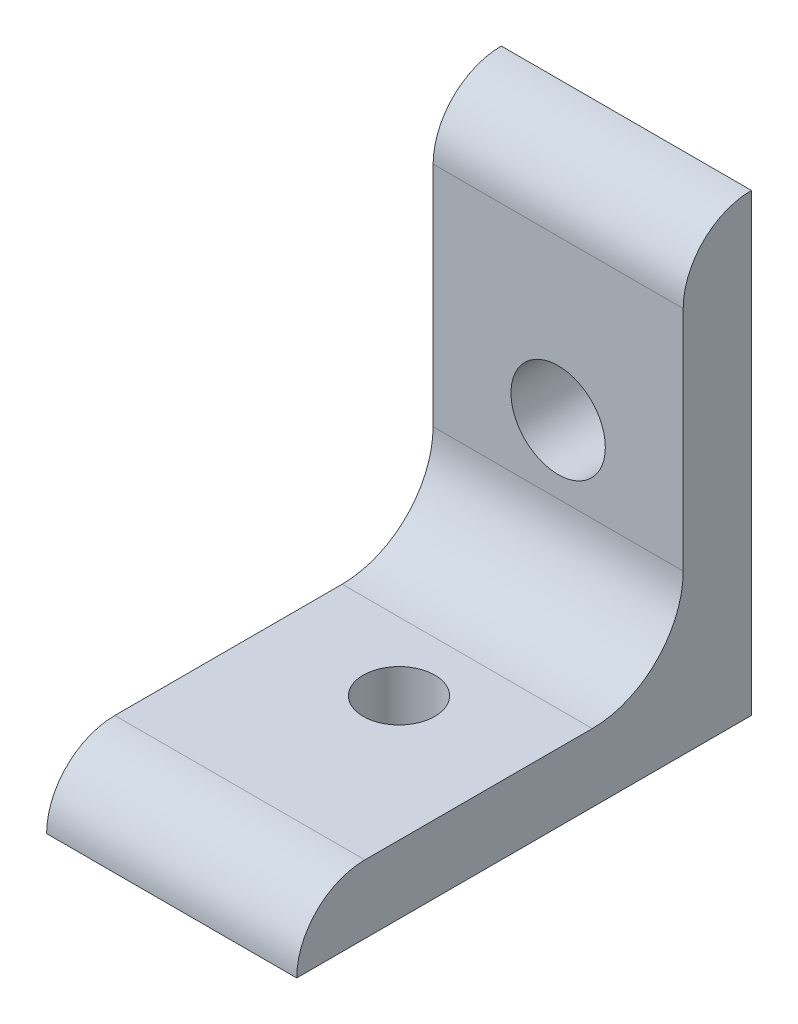
ISO-10303-21;
HEADER;
FILE_DESCRIPTION(('STEP AP214'),'2;1');
FILE_NAME('part.step','',(''),(''),'','','');
FILE_SCHEMA(('AUTOMOTIVE_DESIGN { 1 0 10303 214 1 1 1 1 }'));
ENDSEC;
DATA;
#1=APPLICATION_CONTEXT('core data for automotive mechanical design processes');
#2=APPLICATION_PROTOCOL_DEFINITION('international standard','automotive_design',2000,#1);
#3=PRODUCT_CONTEXT('',#1,'mechanical');
#4=PRODUCT('Part','Part','',(#3));
#5=PRODUCT_RELATED_PRODUCT_CATEGORY('part','',(#4));
#6=PRODUCT_DEFINITION_FORMATION('','',#4);
#7=PRODUCT_DEFINITION_CONTEXT('part definition',#1,'design');
#8=PRODUCT_DEFINITION('design','',#6,#7);
#9=PRODUCT_DEFINITION_SHAPE('','',#8);
#10=(LENGTH_UNIT() NAMED_UNIT(*) SI_UNIT(.MILLI.,.METRE.));
#11=(NAMED_UNIT(*) PLANE_ANGLE_UNIT() SI_UNIT($,.RADIAN.));
#12=(NAMED_UNIT(*) SI_UNIT($,.STERADIAN.) SOLID_ANGLE_UNIT());
#13=UNCERTAINTY_MEASURE_WITH_UNIT(LENGTH_MEASURE(1.E-05),#10,'distance_accuracy_value','');
#14=(GEOMETRIC_REPRESENTATION_CONTEXT(3) GLOBAL_UNCERTAINTY_ASSIGNED_CONTEXT((#13)) GLOBAL_UNIT_ASSIGNED_CONTEXT((#10,
#11,#12)) REPRESENTATION_CONTEXT('',''));
#15=CARTESIAN_POINT('',(0.,0.,0.));
#16=DIRECTION('',(0.,0.,1.));
#17=DIRECTION('',(1.,0.,0.));
#18=AXIS2_PLACEMENT_3D('',#15,#16,#17);
#19=CARTESIAN_POINT('',(-11.,0.,34.));
#20=DIRECTION('',(1.,0.,0.));
#21=DIRECTION('',(0.,1.,0.));
#22=AXIS2_PLACEMENT_3D('',#19,#20,#21);
#23=PLANE('',#22);
#24=CARTESIAN_POINT('',(-11.,0.,34.));
#25=DIRECTION('',(1.,0.,0.));
#26=DIRECTION('',(0.,0.,-1.));
#27=AXIS2_PLACEMENT_3D('',#24,#25,#26);
#28=CIRCLE('',#27,6.);
#29=CARTESIAN_POINT('',(-11.,6.,34.));
#30=VERTEX_POINT('',#29);
#31=CARTESIAN_POINT('',(-11.,0.,40.));
#32=VERTEX_POINT('',#31);
#33=EDGE_CURVE('E132',#30,#32,#28,.T.);
#34=ORIENTED_EDGE('',*,*,#33,.F.);
#35=DIRECTION('',(0.,0.,1.));
#36=VECTOR('',#35,1.);
#37=CARTESIAN_POINT('',(-11.,6.,14.));
#38=LINE('',#37,#36);
#39=CARTESIAN_POINT('',(-11.,6.,14.));
#40=VERTEX_POINT('',#39);
#41=EDGE_CURVE('E130',#40,#30,#38,.T.);
#42=ORIENTED_EDGE('',*,*,#41,.F.);
#43=CARTESIAN_POINT('',(-11.,14.,14.));
#44=DIRECTION('',(1.,0.,0.));
#45=DIRECTION('',(0.,0.,-1.));
#46=AXIS2_PLACEMENT_3D('',#43,#44,#45);
#47=CIRCLE('',#46,8.);
#48=CARTESIAN_POINT('',(-11.,14.,6.));
#49=VERTEX_POINT('',#48);
#50=EDGE_CURVE('E112',#40,#49,#47,.T.);
#51=ORIENTED_EDGE('',*,*,#50,.T.);
#52=DIRECTION('',(0.,-1.,0.));
#53=VECTOR('',#52,1.);
#54=CARTESIAN_POINT('',(-11.,34.,6.));
#55=LINE('',#54,#53);
#56=CARTESIAN_POINT('',(-11.,34.,6.));
#57=VERTEX_POINT('',#56);
#58=EDGE_CURVE('E44',#57,#49,#55,.T.);
#59=ORIENTED_EDGE('',*,*,#58,.F.);
#60=CARTESIAN_POINT('',(-11.,34.,0.));
#61=DIRECTION('',(1.,0.,0.));
#62=DIRECTION('',(0.,0.,-1.));
#63=AXIS2_PLACEMENT_3D('',#60,#61,#62);
#64=CIRCLE('',#63,6.);
#65=CARTESIAN_POINT('',(-11.,40.,0.));
#66=VERTEX_POINT('',#65);
#67=EDGE_CURVE('E201',#66,#57,#64,.T.);
#68=ORIENTED_EDGE('',*,*,#67,.F.);
#69=DIRECTION('',(0.,1.,0.));
#70=VECTOR('',#69,1.);
#71=CARTESIAN_POINT('',(-11.,0.,0.));
#72=LINE('',#71,#70);
#73=CARTESIAN_POINT('',(-11.,0.,0.));
#74=VERTEX_POINT('',#73);
#75=EDGE_CURVE('E191',#74,#66,#72,.T.);
#76=ORIENTED_EDGE('',*,*,#75,.F.);
#77=DIRECTION('',(0.,0.,-1.));
#78=VECTOR('',#77,1.);
#79=CARTESIAN_POINT('',(-11.,0.,40.));
#80=LINE('',#79,#78);
#81=EDGE_CURVE('E180',#32,#74,#80,.T.);
#82=ORIENTED_EDGE('',*,*,#81,.F.);
#83=EDGE_LOOP('',(#34,#42,#51,#59,#68,#76,#82));
#84=FACE_BOUND('',#83,.T.);
#85=ADVANCED_FACE('F17',(#84),#23,.F.);
#86=CARTESIAN_POINT('',(0.,20.,40.));
#87=DIRECTION('',(0.,0.,1.));
#88=DIRECTION('',(-1.,0.,0.));
#89=AXIS2_PLACEMENT_3D('',#86,#87,#88);
#90=CYLINDRICAL_SURFACE('',#89,4.15);
#91=CARTESIAN_POINT('',(0.,20.,0.));
#92=DIRECTION('',(0.,0.,1.));
#93=DIRECTION('',(1.,0.,0.));
#94=AXIS2_PLACEMENT_3D('',#91,#92,#93);
#95=CIRCLE('',#94,4.15);
#96=CARTESIAN_POINT('',(4.15,20.,0.));
#97=VERTEX_POINT('',#96);
#98=EDGE_CURVE('E200',#97,#97,#95,.T.);
#99=ORIENTED_EDGE('',*,*,#98,.F.);
#100=DIRECTION('',(0.,0.,1.));
#101=VECTOR('',#100,1.);
#102=CARTESIAN_POINT('',(4.15,20.,40.));
#103=LINE('',#102,#101);
#104=CARTESIAN_POINT('',(4.15,20.,6.));
#105=VERTEX_POINT('',#104);
#106=EDGE_CURVE('E11',#97,#105,#103,.T.);
#107=ORIENTED_EDGE('',*,*,#106,.T.);
#108=CARTESIAN_POINT('',(0.,20.,6.));
#109=DIRECTION('',(0.,0.,1.));
#110=DIRECTION('',(-1.,0.,0.));
#111=AXIS2_PLACEMENT_3D('',#108,#109,#110);
#112=CIRCLE('',#111,4.15);
#113=EDGE_CURVE('E215',#105,#105,#112,.T.);
#114=ORIENTED_EDGE('',*,*,#113,.T.);
#115=ORIENTED_EDGE('',*,*,#106,.F.);
#116=EDGE_LOOP('',(#99,#107,#114,#115));
#117=FACE_BOUND('',#116,.T.);
#118=ADVANCED_FACE('F19',(#117),#90,.F.);
#119=CARTESIAN_POINT('',(0.,40.,20.));
#120=DIRECTION('',(0.,1.,0.));
#121=DIRECTION('',(0.,0.,-1.));
#122=AXIS2_PLACEMENT_3D('',#119,#120,#121);
#123=CYLINDRICAL_SURFACE('',#122,3.15);
#124=CARTESIAN_POINT('',(0.,0.,20.));
#125=DIRECTION('',(0.,1.,0.));
#126=DIRECTION('',(1.,0.,0.));
#127=AXIS2_PLACEMENT_3D('',#124,#125,#126);
#128=CIRCLE('',#127,3.15);
#129=CARTESIAN_POINT('',(0.,0.,23.15));
#130=VERTEX_POINT('',#129);
#131=EDGE_CURVE('E190',#130,#130,#128,.T.);
#132=ORIENTED_EDGE('',*,*,#131,.F.);
#133=DIRECTION('',(0.,1.,0.));
#134=VECTOR('',#133,1.);
#135=CARTESIAN_POINT('',(0.,40.,23.15));
#136=LINE('',#135,#134);
#137=CARTESIAN_POINT('',(0.,6.,23.15));
#138=VERTEX_POINT('',#137);
#139=EDGE_CURVE('E27',#130,#138,#136,.T.);
#140=ORIENTED_EDGE('',*,*,#139,.T.);
#141=CARTESIAN_POINT('',(0.,6.,20.));
#142=DIRECTION('',(0.,1.,0.));
#143=DIRECTION('',(0.,0.,-1.));
#144=AXIS2_PLACEMENT_3D('',#141,#142,#143);
#145=CIRCLE('',#144,3.15);
#146=EDGE_CURVE('E129',#138,#138,#145,.T.);
#147=ORIENTED_EDGE('',*,*,#146,.T.);
#148=ORIENTED_EDGE('',*,*,#139,.F.);
#149=EDGE_LOOP('',(#132,#140,#147,#148));
#150=FACE_BOUND('',#149,.T.);
#151=ADVANCED_FACE('F218',(#150),#123,.F.);
#152=CARTESIAN_POINT('',(11.,34.,6.));
#153=DIRECTION('',(0.,0.,-1.));
#154=DIRECTION('',(0.,-1.,0.));
#155=AXIS2_PLACEMENT_3D('',#152,#153,#154);
#156=PLANE('',#155);
#157=ORIENTED_EDGE('',*,*,#113,.F.);
#158=EDGE_LOOP('',(#157));
#159=FACE_BOUND('',#158,.T.);
#160=ORIENTED_EDGE('',*,*,#58,.T.);
#161=DIRECTION('',(-1.,0.,0.));
#162=VECTOR('',#161,1.);
#163=CARTESIAN_POINT('',(11.,14.,6.));
#164=LINE('',#163,#162);
#165=CARTESIAN_POINT('',(11.,14.,6.));
#166=VERTEX_POINT('',#165);
#167=EDGE_CURVE('E117',#166,#49,#164,.T.);
#168=ORIENTED_EDGE('',*,*,#167,.F.);
#169=DIRECTION('',(0.,-1.,0.));
#170=VECTOR('',#169,1.);
#171=CARTESIAN_POINT('',(11.,34.,6.));
#172=LINE('',#171,#170);
#173=CARTESIAN_POINT('',(11.,34.,6.));
#174=VERTEX_POINT('',#173);
#175=EDGE_CURVE('E170',#174,#166,#172,.T.);
#176=ORIENTED_EDGE('',*,*,#175,.F.);
#177=DIRECTION('',(-1.,0.,0.));
#178=VECTOR('',#177,1.);
#179=CARTESIAN_POINT('',(11.,34.,6.));
#180=LINE('',#179,#178);
#181=EDGE_CURVE('E210',#174,#57,#180,.T.);
#182=ORIENTED_EDGE('',*,*,#181,.T.);
#183=EDGE_LOOP('',(#160,#168,#176,#182));
#184=FACE_BOUND('',#183,.T.);
#185=ADVANCED_FACE('F253',(#159,#184),#156,.F.);
#186=CARTESIAN_POINT('',(11.,34.,0.));
#187=DIRECTION('',(1.,0.,0.));
#188=DIRECTION('',(0.,0.,1.));
#189=AXIS2_PLACEMENT_3D('',#186,#187,#188);
#190=CYLINDRICAL_SURFACE('',#189,6.);
#191=ORIENTED_EDGE('',*,*,#67,.T.);
#192=ORIENTED_EDGE('',*,*,#181,.F.);
#193=CARTESIAN_POINT('',(11.,34.,0.));
#194=DIRECTION('',(1.,0.,0.));
#195=DIRECTION('',(0.,0.,-1.));
#196=AXIS2_PLACEMENT_3D('',#193,#194,#195);
#197=CIRCLE('',#196,6.);
#198=CARTESIAN_POINT('',(11.,40.,0.));
#199=VERTEX_POINT('',#198);
#200=EDGE_CURVE('E150',#199,#174,#197,.T.);
#201=ORIENTED_EDGE('',*,*,#200,.F.);
#202=DIRECTION('',(-1.,0.,0.));
#203=VECTOR('',#202,1.);
#204=CARTESIAN_POINT('',(11.,40.,0.));
#205=LINE('',#204,#203);
#206=EDGE_CURVE('E194',#199,#66,#205,.T.);
#207=ORIENTED_EDGE('',*,*,#206,.T.);
#208=EDGE_LOOP('',(#191,#192,#201,#207));
#209=FACE_BOUND('',#208,.T.);
#210=ADVANCED_FACE('F251',(#209),#190,.T.);
#211=CARTESIAN_POINT('',(11.,0.,0.));
#212=DIRECTION('',(0.,0.,1.));
#213=DIRECTION('',(1.,0.,0.));
#214=AXIS2_PLACEMENT_3D('',#211,#212,#213);
#215=PLANE('',#214);
#216=ORIENTED_EDGE('',*,*,#98,.T.);
#217=EDGE_LOOP('',(#216));
#218=FACE_BOUND('',#217,.T.);
#219=ORIENTED_EDGE('',*,*,#75,.T.);
#220=ORIENTED_EDGE('',*,*,#206,.F.);
#221=DIRECTION('',(0.,1.,0.));
#222=VECTOR('',#221,1.);
#223=CARTESIAN_POINT('',(11.,0.,0.));
#224=LINE('',#223,#222);
#225=CARTESIAN_POINT('',(11.,0.,0.));
#226=VERTEX_POINT('',#225);
#227=EDGE_CURVE('E145',#226,#199,#224,.T.);
#228=ORIENTED_EDGE('',*,*,#227,.F.);
#229=DIRECTION('',(-1.,0.,0.));
#230=VECTOR('',#229,1.);
#231=CARTESIAN_POINT('',(11.,0.,0.));
#232=LINE('',#231,#230);
#233=EDGE_CURVE('E183',#226,#74,#232,.T.);
#234=ORIENTED_EDGE('',*,*,#233,.T.);
#235=EDGE_LOOP('',(#219,#220,#228,#234));
#236=FACE_BOUND('',#235,.T.);
#237=ADVANCED_FACE('F226',(#218,#236),#215,.F.);
#238=CARTESIAN_POINT('',(11.,0.,40.));
#239=DIRECTION('',(0.,1.,0.));
#240=DIRECTION('',(1.,0.,0.));
#241=AXIS2_PLACEMENT_3D('',#238,#239,#240);
#242=PLANE('',#241);
#243=ORIENTED_EDGE('',*,*,#131,.T.);
#244=EDGE_LOOP('',(#243));
#245=FACE_BOUND('',#244,.T.);
#246=ORIENTED_EDGE('',*,*,#81,.T.);
#247=ORIENTED_EDGE('',*,*,#233,.F.);
#248=DIRECTION('',(0.,0.,-1.));
#249=VECTOR('',#248,1.);
#250=CARTESIAN_POINT('',(11.,0.,40.));
#251=LINE('',#250,#249);
#252=CARTESIAN_POINT('',(11.,0.,40.));
#253=VERTEX_POINT('',#252);
#254=EDGE_CURVE('E146',#253,#226,#251,.T.);
#255=ORIENTED_EDGE('',*,*,#254,.F.);
#256=DIRECTION('',(-1.,0.,0.));
#257=VECTOR('',#256,1.);
#258=CARTESIAN_POINT('',(11.,0.,40.));
#259=LINE('',#258,#257);
#260=EDGE_CURVE('E168',#253,#32,#259,.T.);
#261=ORIENTED_EDGE('',*,*,#260,.T.);
#262=EDGE_LOOP('',(#246,#247,#255,#261));
#263=FACE_BOUND('',#262,.T.);
#264=ADVANCED_FACE('F225',(#245,#263),#242,.F.);
#265=CARTESIAN_POINT('',(11.,0.,34.));
#266=DIRECTION('',(1.,0.,0.));
#267=DIRECTION('',(0.,0.,1.));
#268=AXIS2_PLACEMENT_3D('',#265,#266,#267);
#269=CYLINDRICAL_SURFACE('',#268,6.);
#270=ORIENTED_EDGE('',*,*,#33,.T.);
#271=ORIENTED_EDGE('',*,*,#260,.F.);
#272=CARTESIAN_POINT('',(11.,0.,34.));
#273=DIRECTION('',(1.,0.,0.));
#274=DIRECTION('',(0.,0.,-1.));
#275=AXIS2_PLACEMENT_3D('',#272,#273,#274);
#276=CIRCLE('',#275,6.);
#277=CARTESIAN_POINT('',(11.,6.,34.));
#278=VERTEX_POINT('',#277);
#279=EDGE_CURVE('E154',#278,#253,#276,.T.);
#280=ORIENTED_EDGE('',*,*,#279,.F.);
#281=DIRECTION('',(-1.,0.,0.));
#282=VECTOR('',#281,1.);
#283=CARTESIAN_POINT('',(11.,6.,34.));
#284=LINE('',#283,#282);
#285=EDGE_CURVE('E136',#278,#30,#284,.T.);
#286=ORIENTED_EDGE('',*,*,#285,.T.);
#287=EDGE_LOOP('',(#270,#271,#280,#286));
#288=FACE_BOUND('',#287,.T.);
#289=ADVANCED_FACE('F223',(#288),#269,.T.);
#290=CARTESIAN_POINT('',(11.,14.,14.));
#291=DIRECTION('',(1.,0.,0.));
#292=DIRECTION('',(0.,0.,1.));
#293=AXIS2_PLACEMENT_3D('',#290,#291,#292);
#294=CYLINDRICAL_SURFACE('',#293,8.);
#295=ORIENTED_EDGE('',*,*,#50,.F.);
#296=DIRECTION('',(-1.,0.,0.));
#297=VECTOR('',#296,1.);
#298=CARTESIAN_POINT('',(11.,6.,14.));
#299=LINE('',#298,#297);
#300=CARTESIAN_POINT('',(11.,6.,14.));
#301=VERTEX_POINT('',#300);
#302=EDGE_CURVE('E113',#301,#40,#299,.T.);
#303=ORIENTED_EDGE('',*,*,#302,.F.);
#304=CARTESIAN_POINT('',(11.,14.,14.));
#305=DIRECTION('',(1.,0.,0.));
#306=DIRECTION('',(0.,0.,-1.));
#307=AXIS2_PLACEMENT_3D('',#304,#305,#306);
#308=CIRCLE('',#307,8.);
#309=EDGE_CURVE('E120',#301,#166,#308,.T.);
#310=ORIENTED_EDGE('',*,*,#309,.T.);
#311=ORIENTED_EDGE('',*,*,#167,.T.);
#312=EDGE_LOOP('',(#295,#303,#310,#311));
#313=FACE_BOUND('',#312,.T.);
#314=ADVANCED_FACE('F114',(#313),#294,.F.);
#315=CARTESIAN_POINT('',(11.,0.,34.));
#316=DIRECTION('',(1.,0.,0.));
#317=DIRECTION('',(0.,1.,0.));
#318=AXIS2_PLACEMENT_3D('',#315,#316,#317);
#319=PLANE('',#318);
#320=ORIENTED_EDGE('',*,*,#279,.T.);
#321=ORIENTED_EDGE('',*,*,#254,.T.);
#322=ORIENTED_EDGE('',*,*,#227,.T.);
#323=ORIENTED_EDGE('',*,*,#200,.T.);
#324=ORIENTED_EDGE('',*,*,#175,.T.);
#325=ORIENTED_EDGE('',*,*,#309,.F.);
#326=DIRECTION('',(0.,0.,1.));
#327=VECTOR('',#326,1.);
#328=CARTESIAN_POINT('',(11.,6.,14.));
#329=LINE('',#328,#327);
#330=EDGE_CURVE('E128',#301,#278,#329,.T.);
#331=ORIENTED_EDGE('',*,*,#330,.T.);
#332=EDGE_LOOP('',(#320,#321,#322,#323,#324,#325,#331));
#333=FACE_BOUND('',#332,.T.);
#334=ADVANCED_FACE('F234',(#333),#319,.T.);
#335=CARTESIAN_POINT('',(11.,6.,14.));
#336=DIRECTION('',(0.,-1.,0.));
#337=DIRECTION('',(0.,0.,-1.));
#338=AXIS2_PLACEMENT_3D('',#335,#336,#337);
#339=PLANE('',#338);
#340=ORIENTED_EDGE('',*,*,#146,.F.);
#341=EDGE_LOOP('',(#340));
#342=FACE_BOUND('',#341,.T.);
#343=ORIENTED_EDGE('',*,*,#41,.T.);
#344=ORIENTED_EDGE('',*,*,#285,.F.);
#345=ORIENTED_EDGE('',*,*,#330,.F.);
#346=ORIENTED_EDGE('',*,*,#302,.T.);
#347=EDGE_LOOP('',(#343,#344,#345,#346));
#348=FACE_BOUND('',#347,.T.);
#349=ADVANCED_FACE('F121',(#342,#348),#339,.F.);
#350=CLOSED_SHELL('',(#85,#118,#151,#185,#210,#237,#264,#289,#314,#334,#349));
#351=MANIFOLD_SOLID_BREP('B1',#350);
#352=ADVANCED_BREP_SHAPE_REPRESENTATION('',(#18,#351),#14);
#353=SHAPE_DEFINITION_REPRESENTATION(#9,#352);
ENDSEC;
END-ISO-10303-21;
